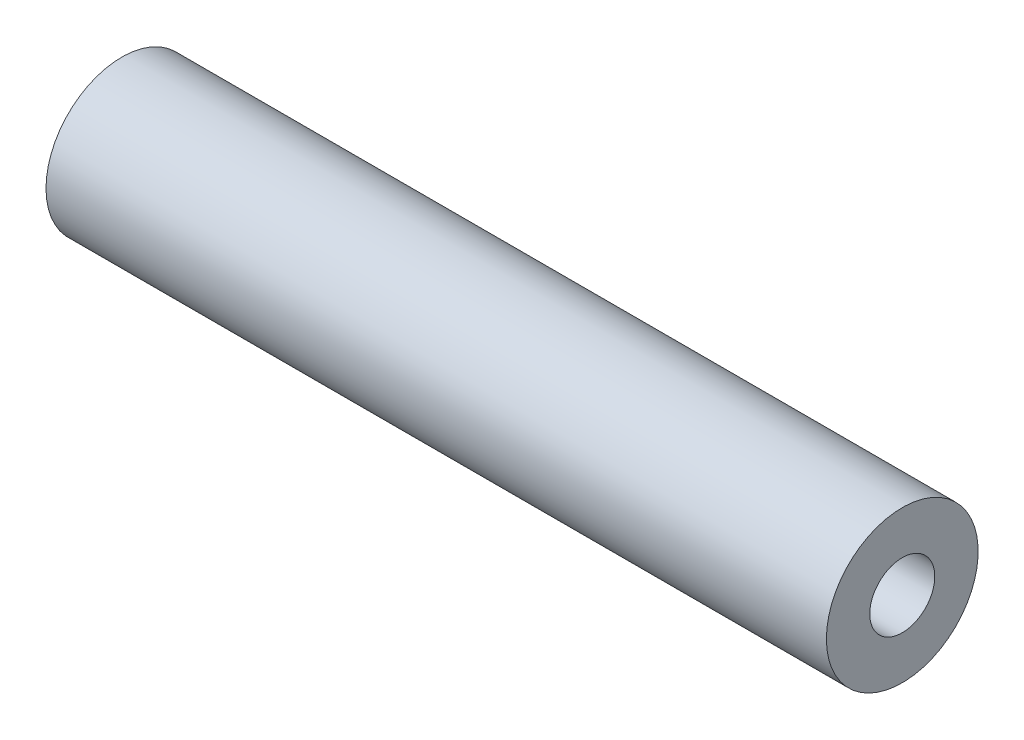
ISO-10303-21;
HEADER;
FILE_DESCRIPTION(('STEP AP214'),'2;1');
FILE_NAME('part.step','',(''),(''),'','','');
FILE_SCHEMA(('AUTOMOTIVE_DESIGN { 1 0 10303 214 1 1 1 1 }'));
ENDSEC;
DATA;
#1=APPLICATION_CONTEXT('core data for automotive mechanical design processes');
#2=APPLICATION_PROTOCOL_DEFINITION('international standard','automotive_design',2000,#1);
#3=PRODUCT_CONTEXT('',#1,'mechanical');
#4=PRODUCT('Part','Part','',(#3));
#5=PRODUCT_RELATED_PRODUCT_CATEGORY('part','',(#4));
#6=PRODUCT_DEFINITION_FORMATION('','',#4);
#7=PRODUCT_DEFINITION_CONTEXT('part definition',#1,'design');
#8=PRODUCT_DEFINITION('design','',#6,#7);
#9=PRODUCT_DEFINITION_SHAPE('','',#8);
#10=(LENGTH_UNIT() NAMED_UNIT(*) SI_UNIT(.MILLI.,.METRE.));
#11=(NAMED_UNIT(*) PLANE_ANGLE_UNIT() SI_UNIT($,.RADIAN.));
#12=(NAMED_UNIT(*) SI_UNIT($,.STERADIAN.) SOLID_ANGLE_UNIT());
#13=UNCERTAINTY_MEASURE_WITH_UNIT(LENGTH_MEASURE(1.E-05),#10,'distance_accuracy_value','');
#14=(GEOMETRIC_REPRESENTATION_CONTEXT(3) GLOBAL_UNCERTAINTY_ASSIGNED_CONTEXT((#13)) GLOBAL_UNIT_ASSIGNED_CONTEXT((#10,
#11,#12)) REPRESENTATION_CONTEXT('',''));
#15=CARTESIAN_POINT('',(0.,0.,0.));
#16=DIRECTION('',(0.,0.,1.));
#17=DIRECTION('',(1.,0.,0.));
#18=AXIS2_PLACEMENT_3D('',#15,#16,#17);
#19=CARTESIAN_POINT('',(30.,17.5,0.));
#20=DIRECTION('',(1.,0.,0.));
#21=DIRECTION('',(0.,0.,-1.));
#22=AXIS2_PLACEMENT_3D('',#19,#20,#21);
#23=PLANE('',#22);
#24=CARTESIAN_POINT('',(30.,0.,0.));
#25=DIRECTION('',(-1.,0.,0.));
#26=DIRECTION('',(0.,0.,1.));
#27=AXIS2_PLACEMENT_3D('',#24,#25,#26);
#28=CIRCLE('',#27,7.5);
#29=CARTESIAN_POINT('',(30.,0.,7.5));
#30=VERTEX_POINT('',#29);
#31=EDGE_CURVE('E10',#30,#30,#28,.T.);
#32=ORIENTED_EDGE('',*,*,#31,.F.);
#33=EDGE_LOOP('',(#32));
#34=FACE_BOUND('',#33,.T.);
#35=CARTESIAN_POINT('',(30.,0.,0.));
#36=DIRECTION('',(-1.,0.,0.));
#37=DIRECTION('',(0.,0.,1.));
#38=AXIS2_PLACEMENT_3D('',#35,#36,#37);
#39=CIRCLE('',#38,17.5);
#40=CARTESIAN_POINT('',(30.,0.,17.5));
#41=VERTEX_POINT('',#40);
#42=EDGE_CURVE('E45',#41,#41,#39,.T.);
#43=ORIENTED_EDGE('',*,*,#42,.T.);
#44=EDGE_LOOP('',(#43));
#45=FACE_BOUND('',#44,.T.);
#46=ADVANCED_FACE('F31',(#34,#45),#23,.F.);
#47=CARTESIAN_POINT('',(0.,0.,0.));
#48=DIRECTION('',(-1.,0.,0.));
#49=DIRECTION('',(0.,0.,1.));
#50=AXIS2_PLACEMENT_3D('',#47,#48,#49);
#51=CYLINDRICAL_SURFACE('',#50,7.5);
#52=CARTESIAN_POINT('',(210.,0.,0.));
#53=DIRECTION('',(-1.,0.,0.));
#54=DIRECTION('',(0.,0.,1.));
#55=AXIS2_PLACEMENT_3D('',#52,#53,#54);
#56=CIRCLE('',#55,7.5);
#57=CARTESIAN_POINT('',(210.,0.,7.5));
#58=VERTEX_POINT('',#57);
#59=EDGE_CURVE('E37',#58,#58,#56,.T.);
#60=ORIENTED_EDGE('',*,*,#59,.F.);
#61=EDGE_LOOP('',(#60));
#62=FACE_BOUND('',#61,.T.);
#63=ORIENTED_EDGE('',*,*,#31,.T.);
#64=EDGE_LOOP('',(#63));
#65=FACE_BOUND('',#64,.T.);
#66=ADVANCED_FACE('F60',(#62,#65),#51,.F.);
#67=CARTESIAN_POINT('',(210.,17.5,0.));
#68=DIRECTION('',(-1.,0.,0.));
#69=DIRECTION('',(0.,0.,1.));
#70=AXIS2_PLACEMENT_3D('',#67,#68,#69);
#71=PLANE('',#70);
#72=CARTESIAN_POINT('',(210.,0.,0.));
#73=DIRECTION('',(-1.,0.,0.));
#74=DIRECTION('',(0.,0.,1.));
#75=AXIS2_PLACEMENT_3D('',#72,#73,#74);
#76=CIRCLE('',#75,17.5);
#77=CARTESIAN_POINT('',(210.,0.,17.5));
#78=VERTEX_POINT('',#77);
#79=EDGE_CURVE('E41',#78,#78,#76,.T.);
#80=ORIENTED_EDGE('',*,*,#79,.F.);
#81=EDGE_LOOP('',(#80));
#82=FACE_BOUND('',#81,.T.);
#83=ORIENTED_EDGE('',*,*,#59,.T.);
#84=EDGE_LOOP('',(#83));
#85=FACE_BOUND('',#84,.T.);
#86=ADVANCED_FACE('F55',(#82,#85),#71,.F.);
#87=CARTESIAN_POINT('',(0.,0.,0.));
#88=DIRECTION('',(-1.,0.,0.));
#89=DIRECTION('',(0.,0.,1.));
#90=AXIS2_PLACEMENT_3D('',#87,#88,#89);
#91=CYLINDRICAL_SURFACE('',#90,17.5);
#92=ORIENTED_EDGE('',*,*,#42,.F.);
#93=EDGE_LOOP('',(#92));
#94=FACE_BOUND('',#93,.T.);
#95=ORIENTED_EDGE('',*,*,#79,.T.);
#96=EDGE_LOOP('',(#95));
#97=FACE_BOUND('',#96,.T.);
#98=ADVANCED_FACE('F52',(#94,#97),#91,.T.);
#99=CLOSED_SHELL('',(#46,#66,#86,#98));
#100=MANIFOLD_SOLID_BREP('B2',#99);
#101=ADVANCED_BREP_SHAPE_REPRESENTATION('',(#18,#100),#14);
#102=SHAPE_DEFINITION_REPRESENTATION(#9,#101);
ENDSEC;
END-ISO-10303-21;
